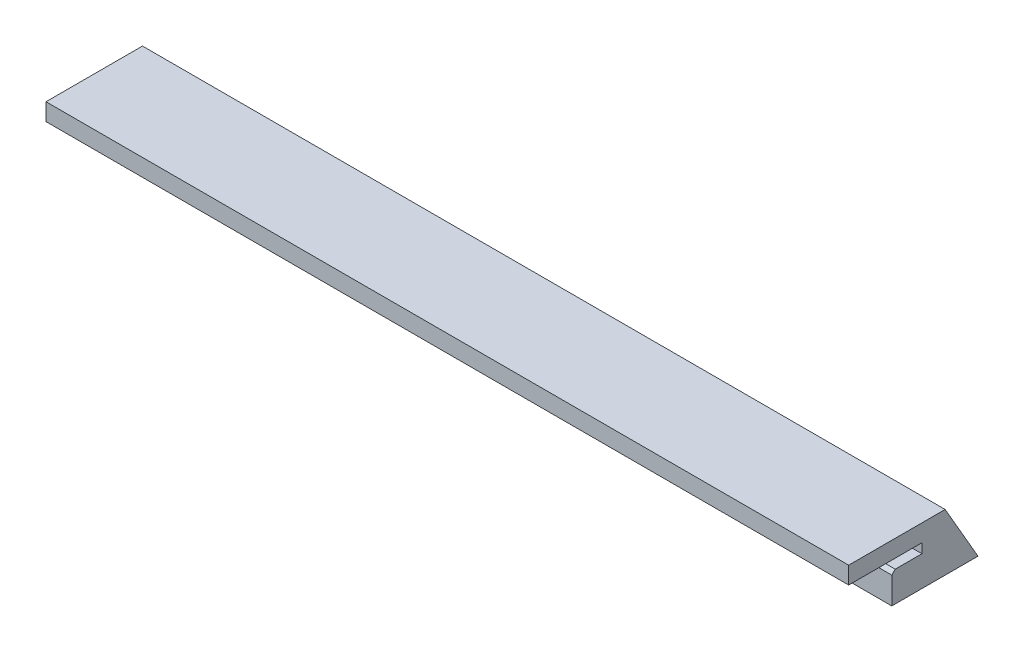
ISO-10303-21;
HEADER;
FILE_DESCRIPTION(('STEP AP214'),'2;1');
FILE_NAME('part.step','',(''),(''),'','','');
FILE_SCHEMA(('AUTOMOTIVE_DESIGN { 1 0 10303 214 1 1 1 1 }'));
ENDSEC;
DATA;
#1=APPLICATION_CONTEXT('core data for automotive mechanical design processes');
#2=APPLICATION_PROTOCOL_DEFINITION('international standard','automotive_design',2000,#1);
#3=PRODUCT_CONTEXT('',#1,'mechanical');
#4=PRODUCT('Part','Part','',(#3));
#5=PRODUCT_RELATED_PRODUCT_CATEGORY('part','',(#4));
#6=PRODUCT_DEFINITION_FORMATION('','',#4);
#7=PRODUCT_DEFINITION_CONTEXT('part definition',#1,'design');
#8=PRODUCT_DEFINITION('design','',#6,#7);
#9=PRODUCT_DEFINITION_SHAPE('','',#8);
#10=(LENGTH_UNIT() NAMED_UNIT(*) SI_UNIT(.MILLI.,.METRE.));
#11=(NAMED_UNIT(*) PLANE_ANGLE_UNIT() SI_UNIT($,.RADIAN.));
#12=(NAMED_UNIT(*) SI_UNIT($,.STERADIAN.) SOLID_ANGLE_UNIT());
#13=UNCERTAINTY_MEASURE_WITH_UNIT(LENGTH_MEASURE(1.E-05),#10,'distance_accuracy_value','');
#14=(GEOMETRIC_REPRESENTATION_CONTEXT(3) GLOBAL_UNCERTAINTY_ASSIGNED_CONTEXT((#13)) GLOBAL_UNIT_ASSIGNED_CONTEXT((#10,
#11,#12)) REPRESENTATION_CONTEXT('',''));
#15=CARTESIAN_POINT('',(0.,0.,0.));
#16=DIRECTION('',(0.,0.,1.));
#17=DIRECTION('',(1.,0.,0.));
#18=AXIS2_PLACEMENT_3D('',#15,#16,#17);
#19=CARTESIAN_POINT('',(0.,3.5,0.));
#20=DIRECTION('',(0.,0.,-1.));
#21=DIRECTION('',(-1.,0.,0.));
#22=AXIS2_PLACEMENT_3D('',#19,#20,#21);
#23=PLANE('',#22);
#24=DIRECTION('',(0.,-1.,0.));
#25=VECTOR('',#24,1.);
#26=CARTESIAN_POINT('',(88.1,4.6,0.));
#27=LINE('',#26,#25);
#28=CARTESIAN_POINT('',(88.1,4.6,0.));
#29=VERTEX_POINT('',#28);
#30=CARTESIAN_POINT('',(88.1,3.1,0.));
#31=VERTEX_POINT('',#30);
#32=EDGE_CURVE('E197',#29,#31,#27,.T.);
#33=ORIENTED_EDGE('',*,*,#32,.F.);
#34=DIRECTION('',(1.,0.,0.));
#35=VECTOR('',#34,1.);
#36=CARTESIAN_POINT('',(0.,4.6,0.));
#37=LINE('',#36,#35);
#38=CARTESIAN_POINT('',(76.399623113199,4.6,0.));
#39=VERTEX_POINT('',#38);
#40=EDGE_CURVE('E182',#39,#29,#37,.T.);
#41=ORIENTED_EDGE('',*,*,#40,.F.);
#42=DIRECTION('',(0.,-1.,0.));
#43=VECTOR('',#42,1.);
#44=CARTESIAN_POINT('',(76.399623113199,6.601,0.));
#45=LINE('',#44,#43);
#46=CARTESIAN_POINT('',(76.399623113199,0.,0.));
#47=VERTEX_POINT('',#46);
#48=EDGE_CURVE('E191',#47,#39,#45,.F.);
#49=ORIENTED_EDGE('',*,*,#48,.F.);
#50=DIRECTION('',(1.,0.,0.));
#51=VECTOR('',#50,1.);
#52=CARTESIAN_POINT('',(0.,0.,0.));
#53=LINE('',#52,#51);
#54=CARTESIAN_POINT('',(93.1,0.,0.));
#55=VERTEX_POINT('',#54);
#56=EDGE_CURVE('E249',#47,#55,#53,.T.);
#57=ORIENTED_EDGE('',*,*,#56,.T.);
#58=DIRECTION('',(0.,-1.,0.));
#59=VECTOR('',#58,1.);
#60=CARTESIAN_POINT('',(93.1,3.5,0.));
#61=LINE('',#60,#59);
#62=CARTESIAN_POINT('',(93.1,3.1,0.));
#63=VERTEX_POINT('',#62);
#64=EDGE_CURVE('E246',#63,#55,#61,.T.);
#65=ORIENTED_EDGE('',*,*,#64,.F.);
#66=DIRECTION('',(-1.,0.,0.));
#67=VECTOR('',#66,1.);
#68=CARTESIAN_POINT('',(0.,3.1,0.));
#69=LINE('',#68,#67);
#70=EDGE_CURVE('E264',#63,#31,#69,.T.);
#71=ORIENTED_EDGE('',*,*,#70,.T.);
#72=EDGE_LOOP('',(#33,#41,#49,#57,#65,#71));
#73=FACE_BOUND('',#72,.T.);
#74=ADVANCED_FACE('F39',(#73),#23,.F.);
#75=CARTESIAN_POINT('',(0.,3.5,0.));
#76=DIRECTION('',(0.,-1.,0.));
#77=DIRECTION('',(0.,0.,-1.));
#78=AXIS2_PLACEMENT_3D('',#75,#76,#77);
#79=PLANE('',#78);
#80=DIRECTION('',(0.,0.,-1.));
#81=VECTOR('',#80,1.);
#82=CARTESIAN_POINT('',(88.1,3.5,83.1072800661891));
#83=LINE('',#82,#81);
#84=CARTESIAN_POINT('',(88.1,3.5,-0.399999999999984));
#85=VERTEX_POINT('',#84);
#86=CARTESIAN_POINT('',(88.1,3.5,-3.5));
#87=VERTEX_POINT('',#86);
#88=EDGE_CURVE('E213',#85,#87,#83,.T.);
#89=ORIENTED_EDGE('',*,*,#88,.F.);
#90=DIRECTION('',(1.,0.,0.));
#91=VECTOR('',#90,1.);
#92=CARTESIAN_POINT('',(0.,3.5,-0.399999999999984));
#93=LINE('',#92,#91);
#94=CARTESIAN_POINT('',(93.1,3.5,-0.399999999999984));
#95=VERTEX_POINT('',#94);
#96=EDGE_CURVE('E271',#85,#95,#93,.T.);
#97=ORIENTED_EDGE('',*,*,#96,.T.);
#98=DIRECTION('',(0.,0.,-1.));
#99=VECTOR('',#98,1.);
#100=CARTESIAN_POINT('',(93.1,3.5,0.));
#101=LINE('',#100,#99);
#102=CARTESIAN_POINT('',(93.1,3.5,-3.5));
#103=VERTEX_POINT('',#102);
#104=EDGE_CURVE('E243',#95,#103,#101,.T.);
#105=ORIENTED_EDGE('',*,*,#104,.T.);
#106=DIRECTION('',(1.,0.,0.));
#107=VECTOR('',#106,1.);
#108=CARTESIAN_POINT('',(0.,3.5,-3.5));
#109=LINE('',#108,#107);
#110=EDGE_CURVE('E226',#87,#103,#109,.T.);
#111=ORIENTED_EDGE('',*,*,#110,.F.);
#112=EDGE_LOOP('',(#89,#97,#105,#111));
#113=FACE_BOUND('',#112,.T.);
#114=ADVANCED_FACE('F321',(#113),#79,.F.);
#115=DIRECTION('',(0.,0.,1.));
#116=VECTOR('',#115,1.);
#117=CARTESIAN_POINT('',(0.,3.5,0.));
#118=LINE('',#117,#116);
#119=CARTESIAN_POINT('',(0.,3.5,-3.5));
#120=VERTEX_POINT('',#119);
#121=CARTESIAN_POINT('',(0.,3.5,-0.399999999999984));
#122=VERTEX_POINT('',#121);
#123=EDGE_CURVE('E240',#120,#122,#118,.T.);
#124=ORIENTED_EDGE('',*,*,#123,.T.);
#125=DIRECTION('',(1.,0.,0.));
#126=VECTOR('',#125,1.);
#127=CARTESIAN_POINT('',(0.,3.5,-0.399999999999984));
#128=LINE('',#127,#126);
#129=CARTESIAN_POINT('',(5.,3.5,-0.399999999999984));
#130=VERTEX_POINT('',#129);
#131=EDGE_CURVE('E261',#122,#130,#128,.T.);
#132=ORIENTED_EDGE('',*,*,#131,.T.);
#133=DIRECTION('',(0.,0.,-1.));
#134=VECTOR('',#133,1.);
#135=CARTESIAN_POINT('',(5.,3.5,83.1072800661891));
#136=LINE('',#135,#134);
#137=CARTESIAN_POINT('',(5.,3.5,-3.5));
#138=VERTEX_POINT('',#137);
#139=EDGE_CURVE('E200',#130,#138,#136,.T.);
#140=ORIENTED_EDGE('',*,*,#139,.T.);
#141=EDGE_CURVE('E233',#120,#138,#109,.T.);
#142=ORIENTED_EDGE('',*,*,#141,.F.);
#143=EDGE_LOOP('',(#124,#132,#140,#142));
#144=FACE_BOUND('',#143,.T.);
#145=ADVANCED_FACE('F323',(#144),#79,.F.);
#146=CARTESIAN_POINT('',(0.,4.6,-3.5));
#147=DIRECTION('',(0.,0.,-1.));
#148=DIRECTION('',(-1.,0.,0.));
#149=AXIS2_PLACEMENT_3D('',#146,#147,#148);
#150=PLANE('',#149);
#151=DIRECTION('',(0.,1.,0.));
#152=VECTOR('',#151,1.);
#153=CARTESIAN_POINT('',(88.1,4.6,-3.5));
#154=LINE('',#153,#152);
#155=CARTESIAN_POINT('',(88.1,4.6,-3.5));
#156=VERTEX_POINT('',#155);
#157=EDGE_CURVE('E206',#87,#156,#154,.T.);
#158=ORIENTED_EDGE('',*,*,#157,.F.);
#159=ORIENTED_EDGE('',*,*,#110,.T.);
#160=DIRECTION('',(0.,-1.,0.));
#161=VECTOR('',#160,1.);
#162=CARTESIAN_POINT('',(93.1,4.6,-3.5));
#163=LINE('',#162,#161);
#164=CARTESIAN_POINT('',(93.1,4.6,-3.5));
#165=VERTEX_POINT('',#164);
#166=EDGE_CURVE('E231',#165,#103,#163,.T.);
#167=ORIENTED_EDGE('',*,*,#166,.F.);
#168=DIRECTION('',(1.,0.,0.));
#169=VECTOR('',#168,1.);
#170=CARTESIAN_POINT('',(0.,4.6,-3.5));
#171=LINE('',#170,#169);
#172=EDGE_CURVE('E232',#156,#165,#171,.T.);
#173=ORIENTED_EDGE('',*,*,#172,.F.);
#174=EDGE_LOOP('',(#158,#159,#167,#173));
#175=FACE_BOUND('',#174,.T.);
#176=ADVANCED_FACE('F310',(#175),#150,.F.);
#177=DIRECTION('',(0.,-1.,0.));
#178=VECTOR('',#177,1.);
#179=CARTESIAN_POINT('',(5.,4.6,-3.5));
#180=LINE('',#179,#178);
#181=CARTESIAN_POINT('',(5.,4.6,-3.5));
#182=VERTEX_POINT('',#181);
#183=EDGE_CURVE('E196',#182,#138,#180,.T.);
#184=ORIENTED_EDGE('',*,*,#183,.F.);
#185=CARTESIAN_POINT('',(0.,4.6,-3.5));
#186=VERTEX_POINT('',#185);
#187=EDGE_CURVE('E229',#186,#182,#171,.T.);
#188=ORIENTED_EDGE('',*,*,#187,.F.);
#189=DIRECTION('',(0.,-1.,0.));
#190=VECTOR('',#189,1.);
#191=CARTESIAN_POINT('',(0.,4.6,-3.5));
#192=LINE('',#191,#190);
#193=EDGE_CURVE('E163',#186,#120,#192,.T.);
#194=ORIENTED_EDGE('',*,*,#193,.T.);
#195=ORIENTED_EDGE('',*,*,#141,.T.);
#196=EDGE_LOOP('',(#184,#188,#194,#195));
#197=FACE_BOUND('',#196,.T.);
#198=ADVANCED_FACE('F359',(#197),#150,.F.);
#199=CARTESIAN_POINT('',(0.,4.6,0.));
#200=DIRECTION('',(0.,1.,0.));
#201=DIRECTION('',(0.,0.,1.));
#202=AXIS2_PLACEMENT_3D('',#199,#200,#201);
#203=PLANE('',#202);
#204=DIRECTION('',(0.,0.,-1.));
#205=VECTOR('',#204,1.);
#206=CARTESIAN_POINT('',(5.,4.6,83.1072800661891));
#207=LINE('',#206,#205);
#208=CARTESIAN_POINT('',(5.,4.6,0.));
#209=VERTEX_POINT('',#208);
#210=EDGE_CURVE('E208',#209,#182,#207,.T.);
#211=ORIENTED_EDGE('',*,*,#210,.F.);
#212=CARTESIAN_POINT('',(16.7003768868009,4.6,0.));
#213=VERTEX_POINT('',#212);
#214=EDGE_CURVE('E55',#209,#213,#37,.T.);
#215=ORIENTED_EDGE('',*,*,#214,.T.);
#216=CARTESIAN_POINT('',(46.55,4.6,147.));
#217=DIRECTION('',(0.,-1.,0.));
#218=DIRECTION('',(0.,0.,-1.));
#219=AXIS2_PLACEMENT_3D('',#216,#217,#218);
#220=CIRCLE('',#219,150.);
#221=EDGE_CURVE('E186',#213,#39,#220,.T.);
#222=ORIENTED_EDGE('',*,*,#221,.T.);
#223=ORIENTED_EDGE('',*,*,#40,.T.);
#224=DIRECTION('',(0.,0.,-1.));
#225=VECTOR('',#224,1.);
#226=CARTESIAN_POINT('',(88.1,4.6,83.1072800661891));
#227=LINE('',#226,#225);
#228=EDGE_CURVE('E210',#29,#156,#227,.T.);
#229=ORIENTED_EDGE('',*,*,#228,.T.);
#230=ORIENTED_EDGE('',*,*,#172,.T.);
#231=DIRECTION('',(0.,0.,-1.));
#232=VECTOR('',#231,1.);
#233=CARTESIAN_POINT('',(93.1,4.6,-10.));
#234=LINE('',#233,#232);
#235=CARTESIAN_POINT('',(93.1,4.6,5.));
#236=VERTEX_POINT('',#235);
#237=EDGE_CURVE('E165',#236,#165,#234,.T.);
#238=ORIENTED_EDGE('',*,*,#237,.F.);
#239=DIRECTION('',(1.,0.,0.));
#240=VECTOR('',#239,1.);
#241=CARTESIAN_POINT('',(0.,4.6,5.));
#242=LINE('',#241,#240);
#243=CARTESIAN_POINT('',(0.,4.6,5.));
#244=VERTEX_POINT('',#243);
#245=EDGE_CURVE('E169',#244,#236,#242,.T.);
#246=ORIENTED_EDGE('',*,*,#245,.F.);
#247=DIRECTION('',(0.,0.,1.));
#248=VECTOR('',#247,1.);
#249=CARTESIAN_POINT('',(0.,4.6,-10.));
#250=LINE('',#249,#248);
#251=EDGE_CURVE('E154',#186,#244,#250,.T.);
#252=ORIENTED_EDGE('',*,*,#251,.F.);
#253=ORIENTED_EDGE('',*,*,#187,.T.);
#254=EDGE_LOOP('',(#211,#215,#222,#223,#229,#230,#238,#246,#252,#253));
#255=FACE_BOUND('',#254,.T.);
#256=ADVANCED_FACE('F170',(#255),#203,.F.);
#257=CARTESIAN_POINT('',(0.,3.5,0.));
#258=DIRECTION('',(1.,0.,0.));
#259=DIRECTION('',(0.,0.,-1.));
#260=AXIS2_PLACEMENT_3D('',#257,#258,#259);
#261=PLANE('',#260);
#262=DIRECTION('',(0.,-1.,0.));
#263=VECTOR('',#262,1.);
#264=CARTESIAN_POINT('',(0.,3.5,0.));
#265=LINE('',#264,#263);
#266=CARTESIAN_POINT('',(0.,3.1,0.));
#267=VERTEX_POINT('',#266);
#268=CARTESIAN_POINT('',(0.,0.,0.));
#269=VERTEX_POINT('',#268);
#270=EDGE_CURVE('E259',#267,#269,#265,.T.);
#271=ORIENTED_EDGE('',*,*,#270,.F.);
#272=DIRECTION('',(0.,-0.70710678118656,0.707106781186535));
#273=VECTOR('',#272,1.);
#274=CARTESIAN_POINT('',(0.,3.5,-0.399999999999984));
#275=LINE('',#274,#273);
#276=EDGE_CURVE('E269',#267,#122,#275,.F.);
#277=ORIENTED_EDGE('',*,*,#276,.T.);
#278=ORIENTED_EDGE('',*,*,#123,.F.);
#279=ORIENTED_EDGE('',*,*,#193,.F.);
#280=ORIENTED_EDGE('',*,*,#251,.T.);
#281=DIRECTION('',(0.,-1.,0.));
#282=VECTOR('',#281,1.);
#283=CARTESIAN_POINT('',(0.,4.6,5.));
#284=LINE('',#283,#282);
#285=CARTESIAN_POINT('',(0.,6.6,5.));
#286=VERTEX_POINT('',#285);
#287=EDGE_CURVE('E160',#286,#244,#284,.T.);
#288=ORIENTED_EDGE('',*,*,#287,.F.);
#289=DIRECTION('',(0.,0.,1.));
#290=VECTOR('',#289,1.);
#291=CARTESIAN_POINT('',(0.,6.6,-10.));
#292=LINE('',#291,#290);
#293=CARTESIAN_POINT('',(0.,6.6,-6.18948822334853));
#294=VERTEX_POINT('',#293);
#295=EDGE_CURVE('E222',#294,#286,#292,.T.);
#296=ORIENTED_EDGE('',*,*,#295,.F.);
#297=DIRECTION('',(0.,0.866025403784442,0.499999999999995));
#298=VECTOR('',#297,1.);
#299=CARTESIAN_POINT('',(0.,0.,-10.));
#300=LINE('',#299,#298);
#301=CARTESIAN_POINT('',(0.,0.,-10.));
#302=VERTEX_POINT('',#301);
#303=EDGE_CURVE('E203',#302,#294,#300,.T.);
#304=ORIENTED_EDGE('',*,*,#303,.F.);
#305=DIRECTION('',(0.,0.,1.));
#306=VECTOR('',#305,1.);
#307=CARTESIAN_POINT('',(0.,0.,0.));
#308=LINE('',#307,#306);
#309=EDGE_CURVE('E239',#302,#269,#308,.T.);
#310=ORIENTED_EDGE('',*,*,#309,.T.);
#311=EDGE_LOOP('',(#271,#277,#278,#279,#280,#288,#296,#304,#310));
#312=FACE_BOUND('',#311,.T.);
#313=ADVANCED_FACE('F157',(#312),#261,.F.);
#314=DIRECTION('',(0.,-1.,0.));
#315=VECTOR('',#314,1.);
#316=CARTESIAN_POINT('',(16.7003768868009,6.601,0.));
#317=LINE('',#316,#315);
#318=CARTESIAN_POINT('',(16.7003768868009,0.,0.));
#319=VERTEX_POINT('',#318);
#320=EDGE_CURVE('E189',#213,#319,#317,.T.);
#321=ORIENTED_EDGE('',*,*,#320,.F.);
#322=ORIENTED_EDGE('',*,*,#214,.F.);
#323=DIRECTION('',(0.,1.,0.));
#324=VECTOR('',#323,1.);
#325=CARTESIAN_POINT('',(5.,4.6,0.));
#326=LINE('',#325,#324);
#327=CARTESIAN_POINT('',(5.,3.1,0.));
#328=VERTEX_POINT('',#327);
#329=EDGE_CURVE('E199',#328,#209,#326,.T.);
#330=ORIENTED_EDGE('',*,*,#329,.F.);
#331=DIRECTION('',(-1.,0.,0.));
#332=VECTOR('',#331,1.);
#333=CARTESIAN_POINT('',(0.,3.1,0.));
#334=LINE('',#333,#332);
#335=EDGE_CURVE('E267',#328,#267,#334,.T.);
#336=ORIENTED_EDGE('',*,*,#335,.T.);
#337=ORIENTED_EDGE('',*,*,#270,.T.);
#338=EDGE_CURVE('E250',#269,#319,#53,.T.);
#339=ORIENTED_EDGE('',*,*,#338,.T.);
#340=EDGE_LOOP('',(#321,#322,#330,#336,#337,#339));
#341=FACE_BOUND('',#340,.T.);
#342=ADVANCED_FACE('F284',(#341),#23,.F.);
#343=CARTESIAN_POINT('',(93.1,3.5,0.));
#344=DIRECTION('',(-1.,0.,0.));
#345=DIRECTION('',(0.,0.,1.));
#346=AXIS2_PLACEMENT_3D('',#343,#344,#345);
#347=PLANE('',#346);
#348=ORIENTED_EDGE('',*,*,#104,.F.);
#349=DIRECTION('',(0.,0.70710678118656,-0.707106781186535));
#350=VECTOR('',#349,1.);
#351=CARTESIAN_POINT('',(93.1,3.5,-0.399999999999984));
#352=LINE('',#351,#350);
#353=EDGE_CURVE('E63',#95,#63,#352,.F.);
#354=ORIENTED_EDGE('',*,*,#353,.T.);
#355=ORIENTED_EDGE('',*,*,#64,.T.);
#356=DIRECTION('',(0.,0.,-1.));
#357=VECTOR('',#356,1.);
#358=CARTESIAN_POINT('',(93.1,0.,0.));
#359=LINE('',#358,#357);
#360=CARTESIAN_POINT('',(93.1,0.,-10.));
#361=VERTEX_POINT('',#360);
#362=EDGE_CURVE('E253',#55,#361,#359,.T.);
#363=ORIENTED_EDGE('',*,*,#362,.T.);
#364=DIRECTION('',(0.,0.866025403784442,0.499999999999995));
#365=VECTOR('',#364,1.);
#366=CARTESIAN_POINT('',(93.1,0.,-10.));
#367=LINE('',#366,#365);
#368=CARTESIAN_POINT('',(93.1,6.6,-6.18948822334853));
#369=VERTEX_POINT('',#368);
#370=EDGE_CURVE('E216',#361,#369,#367,.T.);
#371=ORIENTED_EDGE('',*,*,#370,.T.);
#372=DIRECTION('',(0.,0.,-1.));
#373=VECTOR('',#372,1.);
#374=CARTESIAN_POINT('',(93.1,6.6,-10.));
#375=LINE('',#374,#373);
#376=CARTESIAN_POINT('',(93.1,6.6,5.));
#377=VERTEX_POINT('',#376);
#378=EDGE_CURVE('E224',#377,#369,#375,.T.);
#379=ORIENTED_EDGE('',*,*,#378,.F.);
#380=DIRECTION('',(0.,1.,0.));
#381=VECTOR('',#380,1.);
#382=CARTESIAN_POINT('',(93.1,4.6,5.));
#383=LINE('',#382,#381);
#384=EDGE_CURVE('E175',#236,#377,#383,.T.);
#385=ORIENTED_EDGE('',*,*,#384,.F.);
#386=ORIENTED_EDGE('',*,*,#237,.T.);
#387=ORIENTED_EDGE('',*,*,#166,.T.);
#388=EDGE_LOOP('',(#348,#354,#355,#363,#371,#379,#385,#386,#387));
#389=FACE_BOUND('',#388,.T.);
#390=ADVANCED_FACE('F315',(#389),#347,.F.);
#391=CARTESIAN_POINT('',(0.,0.,0.));
#392=DIRECTION('',(0.,-1.,0.));
#393=DIRECTION('',(0.,0.,-1.));
#394=AXIS2_PLACEMENT_3D('',#391,#392,#393);
#395=PLANE('',#394);
#396=CARTESIAN_POINT('',(46.55,0.,147.));
#397=DIRECTION('',(0.,-1.,0.));
#398=DIRECTION('',(0.,0.,-1.));
#399=AXIS2_PLACEMENT_3D('',#396,#397,#398);
#400=CIRCLE('',#399,150.);
#401=EDGE_CURVE('E194',#319,#47,#400,.T.);
#402=ORIENTED_EDGE('',*,*,#401,.F.);
#403=ORIENTED_EDGE('',*,*,#338,.F.);
#404=ORIENTED_EDGE('',*,*,#309,.F.);
#405=DIRECTION('',(-1.,0.,0.));
#406=VECTOR('',#405,1.);
#407=CARTESIAN_POINT('',(0.,0.,-10.));
#408=LINE('',#407,#406);
#409=EDGE_CURVE('E244',#361,#302,#408,.T.);
#410=ORIENTED_EDGE('',*,*,#409,.F.);
#411=ORIENTED_EDGE('',*,*,#362,.F.);
#412=ORIENTED_EDGE('',*,*,#56,.F.);
#413=EDGE_LOOP('',(#402,#403,#404,#410,#411,#412));
#414=FACE_BOUND('',#413,.T.);
#415=ADVANCED_FACE('F291',(#414),#395,.T.);
#416=CARTESIAN_POINT('',(0.,6.6,0.));
#417=DIRECTION('',(0.,1.,0.));
#418=DIRECTION('',(0.,0.,1.));
#419=AXIS2_PLACEMENT_3D('',#416,#417,#418);
#420=PLANE('',#419);
#421=DIRECTION('',(-1.,0.,0.));
#422=VECTOR('',#421,1.);
#423=CARTESIAN_POINT('',(0.,6.6,5.));
#424=LINE('',#423,#422);
#425=EDGE_CURVE('E180',#377,#286,#424,.T.);
#426=ORIENTED_EDGE('',*,*,#425,.F.);
#427=ORIENTED_EDGE('',*,*,#378,.T.);
#428=DIRECTION('',(-1.,0.,0.));
#429=VECTOR('',#428,1.);
#430=CARTESIAN_POINT('',(93.1,6.6,-6.18948822334853));
#431=LINE('',#430,#429);
#432=EDGE_CURVE('E166',#369,#294,#431,.T.);
#433=ORIENTED_EDGE('',*,*,#432,.T.);
#434=ORIENTED_EDGE('',*,*,#295,.T.);
#435=EDGE_LOOP('',(#426,#427,#433,#434));
#436=FACE_BOUND('',#435,.T.);
#437=ADVANCED_FACE('F317',(#436),#420,.T.);
#438=CARTESIAN_POINT('',(93.1,0.,-10.));
#439=DIRECTION('',(0.,-0.499999999999995,0.866025403784442));
#440=DIRECTION('',(0.,-0.866025403784442,-0.499999999999995));
#441=AXIS2_PLACEMENT_3D('',#438,#439,#440);
#442=PLANE('',#441);
#443=ORIENTED_EDGE('',*,*,#303,.T.);
#444=ORIENTED_EDGE('',*,*,#432,.F.);
#445=ORIENTED_EDGE('',*,*,#370,.F.);
#446=ORIENTED_EDGE('',*,*,#409,.T.);
#447=EDGE_LOOP('',(#443,#444,#445,#446));
#448=FACE_BOUND('',#447,.T.);
#449=ADVANCED_FACE('F319',(#448),#442,.F.);
#450=CARTESIAN_POINT('',(88.1,4.6,83.1072800661891));
#451=DIRECTION('',(-1.,0.,0.));
#452=DIRECTION('',(0.,0.,1.));
#453=AXIS2_PLACEMENT_3D('',#450,#451,#452);
#454=PLANE('',#453);
#455=ORIENTED_EDGE('',*,*,#228,.F.);
#456=ORIENTED_EDGE('',*,*,#32,.T.);
#457=DIRECTION('',(0.,-0.70710678118656,0.707106781186535));
#458=VECTOR('',#457,1.);
#459=CARTESIAN_POINT('',(88.1,-37.7036400330945,40.8036400330931));
#460=LINE('',#459,#458);
#461=EDGE_CURVE('E11',#31,#85,#460,.F.);
#462=ORIENTED_EDGE('',*,*,#461,.T.);
#463=ORIENTED_EDGE('',*,*,#88,.T.);
#464=ORIENTED_EDGE('',*,*,#157,.T.);
#465=EDGE_LOOP('',(#455,#456,#462,#463,#464));
#466=FACE_BOUND('',#465,.T.);
#467=ADVANCED_FACE('F304',(#466),#454,.F.);
#468=CARTESIAN_POINT('',(5.,4.6,83.1072800661891));
#469=DIRECTION('',(1.,0.,0.));
#470=DIRECTION('',(0.,0.,-1.));
#471=AXIS2_PLACEMENT_3D('',#468,#469,#470);
#472=PLANE('',#471);
#473=ORIENTED_EDGE('',*,*,#139,.F.);
#474=DIRECTION('',(0.,0.70710678118656,-0.707106781186535));
#475=VECTOR('',#474,1.);
#476=CARTESIAN_POINT('',(5.,-37.7036400330945,40.8036400330931));
#477=LINE('',#476,#475);
#478=EDGE_CURVE('E48',#130,#328,#477,.F.);
#479=ORIENTED_EDGE('',*,*,#478,.T.);
#480=ORIENTED_EDGE('',*,*,#329,.T.);
#481=ORIENTED_EDGE('',*,*,#210,.T.);
#482=ORIENTED_EDGE('',*,*,#183,.T.);
#483=EDGE_LOOP('',(#473,#479,#480,#481,#482));
#484=FACE_BOUND('',#483,.T.);
#485=ADVANCED_FACE('F277',(#484),#472,.F.);
#486=CARTESIAN_POINT('',(0.,3.5,-0.399999999999984));
#487=DIRECTION('',(0.,-0.707106781186535,-0.70710678118656));
#488=DIRECTION('',(1.,0.,0.));
#489=AXIS2_PLACEMENT_3D('',#486,#487,#488);
#490=PLANE('',#489);
#491=ORIENTED_EDGE('',*,*,#276,.F.);
#492=ORIENTED_EDGE('',*,*,#335,.F.);
#493=ORIENTED_EDGE('',*,*,#478,.F.);
#494=ORIENTED_EDGE('',*,*,#131,.F.);
#495=EDGE_LOOP('',(#491,#492,#493,#494));
#496=FACE_BOUND('',#495,.T.);
#497=ADVANCED_FACE('F281',(#496),#490,.F.);
#498=CARTESIAN_POINT('',(0.,3.5,-0.399999999999984));
#499=DIRECTION('',(0.,-0.707106781186535,-0.70710678118656));
#500=DIRECTION('',(1.,0.,0.));
#501=AXIS2_PLACEMENT_3D('',#498,#499,#500);
#502=PLANE('',#501);
#503=ORIENTED_EDGE('',*,*,#461,.F.);
#504=ORIENTED_EDGE('',*,*,#70,.F.);
#505=ORIENTED_EDGE('',*,*,#353,.F.);
#506=ORIENTED_EDGE('',*,*,#96,.F.);
#507=EDGE_LOOP('',(#503,#504,#505,#506));
#508=FACE_BOUND('',#507,.T.);
#509=ADVANCED_FACE('F42',(#508),#502,.F.);
#510=CARTESIAN_POINT('',(46.55,6.601,147.));
#511=DIRECTION('',(0.,-1.,0.));
#512=DIRECTION('',(0.,0.,-1.));
#513=AXIS2_PLACEMENT_3D('',#510,#511,#512);
#514=CYLINDRICAL_SURFACE('',#513,150.);
#515=ORIENTED_EDGE('',*,*,#48,.T.);
#516=ORIENTED_EDGE('',*,*,#221,.F.);
#517=ORIENTED_EDGE('',*,*,#320,.T.);
#518=ORIENTED_EDGE('',*,*,#401,.T.);
#519=EDGE_LOOP('',(#515,#516,#517,#518));
#520=FACE_BOUND('',#519,.T.);
#521=ADVANCED_FACE('F295',(#520),#514,.F.);
#522=CARTESIAN_POINT('',(0.,0.,5.));
#523=DIRECTION('',(0.,0.,-1.));
#524=DIRECTION('',(-1.,0.,0.));
#525=AXIS2_PLACEMENT_3D('',#522,#523,#524);
#526=PLANE('',#525);
#527=ORIENTED_EDGE('',*,*,#287,.T.);
#528=ORIENTED_EDGE('',*,*,#245,.T.);
#529=ORIENTED_EDGE('',*,*,#384,.T.);
#530=ORIENTED_EDGE('',*,*,#425,.T.);
#531=EDGE_LOOP('',(#527,#528,#529,#530));
#532=FACE_BOUND('',#531,.T.);
#533=ADVANCED_FACE('F178',(#532),#526,.F.);
#534=CLOSED_SHELL('',(#74,#114,#145,#176,#198,#256,#313,#342,#390,#415,#437,#449,#467,#485,#497,
#509,#521,#533));
#535=MANIFOLD_SOLID_BREP('B2',#534);
#536=ADVANCED_BREP_SHAPE_REPRESENTATION('',(#18,#535),#14);
#537=SHAPE_DEFINITION_REPRESENTATION(#9,#536);
ENDSEC;
END-ISO-10303-21;
